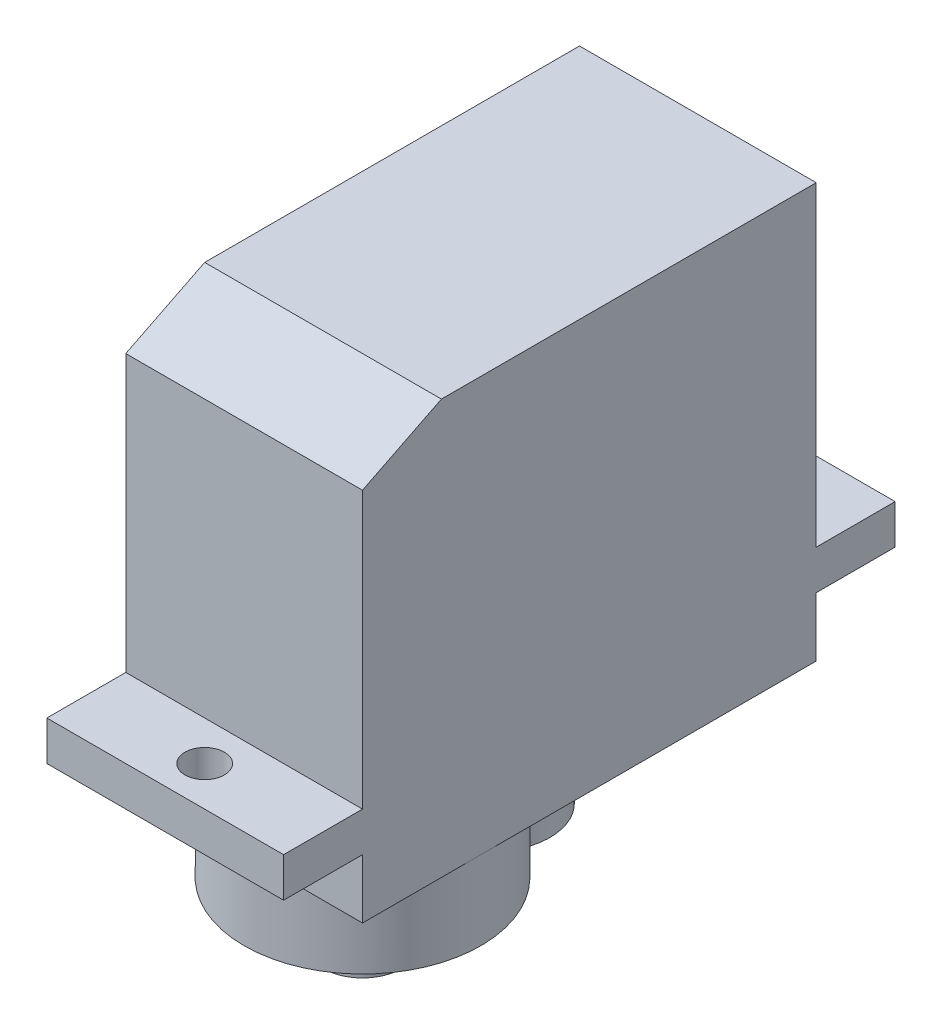
ISO-10303-21;
HEADER;
FILE_DESCRIPTION(('STEP AP214'),'2;1');
FILE_NAME('part.step','',(''),(''),'','','');
FILE_SCHEMA(('AUTOMOTIVE_DESIGN { 1 0 10303 214 1 1 1 1 }'));
ENDSEC;
DATA;
#1=APPLICATION_CONTEXT('core data for automotive mechanical design processes');
#2=APPLICATION_PROTOCOL_DEFINITION('international standard','automotive_design',2000,#1);
#3=PRODUCT_CONTEXT('',#1,'mechanical');
#4=PRODUCT('Part','Part','',(#3));
#5=PRODUCT_RELATED_PRODUCT_CATEGORY('part','',(#4));
#6=PRODUCT_DEFINITION_FORMATION('','',#4);
#7=PRODUCT_DEFINITION_CONTEXT('part definition',#1,'design');
#8=PRODUCT_DEFINITION('design','',#6,#7);
#9=PRODUCT_DEFINITION_SHAPE('','',#8);
#10=(LENGTH_UNIT() NAMED_UNIT(*) SI_UNIT(.MILLI.,.METRE.));
#11=(NAMED_UNIT(*) PLANE_ANGLE_UNIT() SI_UNIT($,.RADIAN.));
#12=(NAMED_UNIT(*) SI_UNIT($,.STERADIAN.) SOLID_ANGLE_UNIT());
#13=UNCERTAINTY_MEASURE_WITH_UNIT(LENGTH_MEASURE(1.E-05),#10,'distance_accuracy_value','');
#14=(GEOMETRIC_REPRESENTATION_CONTEXT(3) GLOBAL_UNCERTAINTY_ASSIGNED_CONTEXT((#13)) GLOBAL_UNIT_ASSIGNED_CONTEXT((#10,
#11,#12)) REPRESENTATION_CONTEXT('',''));
#15=CARTESIAN_POINT('',(0.,0.,0.));
#16=DIRECTION('',(0.,0.,1.));
#17=DIRECTION('',(1.,0.,0.));
#18=AXIS2_PLACEMENT_3D('',#15,#16,#17);
#19=CARTESIAN_POINT('',(0.,0.,0.));
#20=DIRECTION('',(0.,1.,0.));
#21=DIRECTION('',(0.,0.,1.));
#22=AXIS2_PLACEMENT_3D('',#19,#20,#21);
#23=PLANE('',#22);
#24=CARTESIAN_POINT('',(0.,0.,-1.));
#25=DIRECTION('',(0.,-1.,0.));
#26=DIRECTION('',(0.,0.,-1.));
#27=AXIS2_PLACEMENT_3D('',#24,#25,#26);
#28=CIRCLE('',#27,3.);
#29=CARTESIAN_POINT('',(-2.761139354061,0.,0.173076923076922));
#30=VERTEX_POINT('',#29);
#31=CARTESIAN_POINT('',(2.761139354061,0.,0.173076923076922));
#32=VERTEX_POINT('',#31);
#33=EDGE_CURVE('E239',#30,#32,#28,.T.);
#34=ORIENTED_EDGE('',*,*,#33,.F.);
#35=CARTESIAN_POINT('',(0.,0.,5.5));
#36=DIRECTION('',(0.,-1.,0.));
#37=DIRECTION('',(0.,0.,-1.));
#38=AXIS2_PLACEMENT_3D('',#35,#36,#37);
#39=CIRCLE('',#38,6.);
#40=CARTESIAN_POINT('',(-6.,0.,5.5));
#41=VERTEX_POINT('',#40);
#42=EDGE_CURVE('E220',#41,#30,#39,.T.);
#43=ORIENTED_EDGE('',*,*,#42,.F.);
#44=DIRECTION('',(0.,0.,1.));
#45=VECTOR('',#44,1.);
#46=CARTESIAN_POINT('',(-6.,0.,-11.5));
#47=LINE('',#46,#45);
#48=CARTESIAN_POINT('',(-6.,0.,-11.5));
#49=VERTEX_POINT('',#48);
#50=EDGE_CURVE('E266',#49,#41,#47,.T.);
#51=ORIENTED_EDGE('',*,*,#50,.F.);
#52=DIRECTION('',(-1.,0.,0.));
#53=VECTOR('',#52,1.);
#54=CARTESIAN_POINT('',(-6.,0.,-11.5));
#55=LINE('',#54,#53);
#56=CARTESIAN_POINT('',(6.,0.,-11.5));
#57=VERTEX_POINT('',#56);
#58=EDGE_CURVE('E252',#57,#49,#55,.T.);
#59=ORIENTED_EDGE('',*,*,#58,.F.);
#60=DIRECTION('',(0.,0.,-1.));
#61=VECTOR('',#60,1.);
#62=CARTESIAN_POINT('',(6.,0.,-11.5));
#63=LINE('',#62,#61);
#64=CARTESIAN_POINT('',(6.,0.,5.5));
#65=VERTEX_POINT('',#64);
#66=EDGE_CURVE('E250',#65,#57,#63,.T.);
#67=ORIENTED_EDGE('',*,*,#66,.F.);
#68=EDGE_CURVE('E89',#32,#65,#39,.T.);
#69=ORIENTED_EDGE('',*,*,#68,.F.);
#70=EDGE_LOOP('',(#34,#43,#51,#59,#67,#69));
#71=FACE_BOUND('',#70,.T.);
#72=ADVANCED_FACE('F64',(#71),#23,.F.);
#73=CARTESIAN_POINT('',(0.,0.,11.5));
#74=VERTEX_POINT('',#73);
#75=EDGE_CURVE('E73',#65,#74,#39,.T.);
#76=ORIENTED_EDGE('',*,*,#75,.F.);
#77=CARTESIAN_POINT('',(6.,0.,11.5));
#78=VERTEX_POINT('',#77);
#79=EDGE_CURVE('E247',#78,#65,#63,.T.);
#80=ORIENTED_EDGE('',*,*,#79,.F.);
#81=DIRECTION('',(1.,0.,0.));
#82=VECTOR('',#81,1.);
#83=CARTESIAN_POINT('',(-6.,0.,11.5));
#84=LINE('',#83,#82);
#85=EDGE_CURVE('E248',#74,#78,#84,.T.);
#86=ORIENTED_EDGE('',*,*,#85,.F.);
#87=EDGE_LOOP('',(#76,#80,#86));
#88=FACE_BOUND('',#87,.T.);
#89=ADVANCED_FACE('F245',(#88),#23,.F.);
#90=CARTESIAN_POINT('',(-6.,21.,-11.5));
#91=DIRECTION('',(0.,0.,1.));
#92=DIRECTION('',(1.,0.,0.));
#93=AXIS2_PLACEMENT_3D('',#90,#91,#92);
#94=PLANE('',#93);
#95=DIRECTION('',(-1.,0.,0.));
#96=VECTOR('',#95,1.);
#97=CARTESIAN_POINT('',(0.,3.,-11.5));
#98=LINE('',#97,#96);
#99=CARTESIAN_POINT('',(6.,3.00000000000001,-11.5));
#100=VERTEX_POINT('',#99);
#101=CARTESIAN_POINT('',(-5.99999999999987,3.,-11.5));
#102=VERTEX_POINT('',#101);
#103=EDGE_CURVE('E309',#100,#102,#98,.T.);
#104=ORIENTED_EDGE('',*,*,#103,.F.);
#105=DIRECTION('',(0.,-1.,0.));
#106=VECTOR('',#105,1.);
#107=CARTESIAN_POINT('',(6.,21.,-11.5));
#108=LINE('',#107,#106);
#109=EDGE_CURVE('E211',#100,#57,#108,.T.);
#110=ORIENTED_EDGE('',*,*,#109,.T.);
#111=ORIENTED_EDGE('',*,*,#58,.T.);
#112=DIRECTION('',(0.,-1.,0.));
#113=VECTOR('',#112,1.);
#114=CARTESIAN_POINT('',(-6.,21.,-11.5));
#115=LINE('',#114,#113);
#116=EDGE_CURVE('E203',#102,#49,#115,.T.);
#117=ORIENTED_EDGE('',*,*,#116,.F.);
#118=EDGE_LOOP('',(#104,#110,#111,#117));
#119=FACE_BOUND('',#118,.T.);
#120=ADVANCED_FACE('F351',(#119),#94,.F.);
#121=CARTESIAN_POINT('',(-6.,21.,11.5));
#122=DIRECTION('',(0.,0.,-1.));
#123=DIRECTION('',(-1.,0.,0.));
#124=AXIS2_PLACEMENT_3D('',#121,#122,#123);
#125=PLANE('',#124);
#126=DIRECTION('',(0.,-1.,0.));
#127=VECTOR('',#126,1.);
#128=CARTESIAN_POINT('',(6.,21.,11.5));
#129=LINE('',#128,#127);
#130=CARTESIAN_POINT('',(6.,19.,11.5));
#131=VERTEX_POINT('',#130);
#132=CARTESIAN_POINT('',(6.,5.,11.5));
#133=VERTEX_POINT('',#132);
#134=EDGE_CURVE('E197',#131,#133,#129,.T.);
#135=ORIENTED_EDGE('',*,*,#134,.F.);
#136=DIRECTION('',(1.,0.,0.));
#137=VECTOR('',#136,1.);
#138=CARTESIAN_POINT('',(-6.,19.,11.5));
#139=LINE('',#138,#137);
#140=CARTESIAN_POINT('',(-6.,19.,11.5));
#141=VERTEX_POINT('',#140);
#142=EDGE_CURVE('E184',#141,#131,#139,.T.);
#143=ORIENTED_EDGE('',*,*,#142,.F.);
#144=DIRECTION('',(0.,-1.,0.));
#145=VECTOR('',#144,1.);
#146=CARTESIAN_POINT('',(-6.,21.,11.5));
#147=LINE('',#146,#145);
#148=CARTESIAN_POINT('',(-6.,5.,11.5));
#149=VERTEX_POINT('',#148);
#150=EDGE_CURVE('E195',#141,#149,#147,.T.);
#151=ORIENTED_EDGE('',*,*,#150,.T.);
#152=DIRECTION('',(-1.,0.,0.));
#153=VECTOR('',#152,1.);
#154=CARTESIAN_POINT('',(0.,5.,11.5));
#155=LINE('',#154,#153);
#156=EDGE_CURVE('E292',#133,#149,#155,.T.);
#157=ORIENTED_EDGE('',*,*,#156,.F.);
#158=EDGE_LOOP('',(#135,#143,#151,#157));
#159=FACE_BOUND('',#158,.T.);
#160=ADVANCED_FACE('F193',(#159),#125,.F.);
#161=CARTESIAN_POINT('',(6.,21.,-11.5));
#162=DIRECTION('',(-1.,0.,0.));
#163=DIRECTION('',(0.,0.,1.));
#164=AXIS2_PLACEMENT_3D('',#161,#162,#163);
#165=PLANE('',#164);
#166=DIRECTION('',(0.,0.,-1.));
#167=VECTOR('',#166,1.);
#168=CARTESIAN_POINT('',(6.,21.,-11.5));
#169=LINE('',#168,#167);
#170=CARTESIAN_POINT('',(6.,21.,7.5));
#171=VERTEX_POINT('',#170);
#172=CARTESIAN_POINT('',(6.,21.,-11.5));
#173=VERTEX_POINT('',#172);
#174=EDGE_CURVE('E269',#171,#173,#169,.T.);
#175=ORIENTED_EDGE('',*,*,#174,.F.);
#176=DIRECTION('',(0.,0.447213595499957,-0.894427190999916));
#177=VECTOR('',#176,1.);
#178=CARTESIAN_POINT('',(6.,19.8,9.89999999999999));
#179=LINE('',#178,#177);
#180=EDGE_CURVE('E81',#131,#171,#179,.T.);
#181=ORIENTED_EDGE('',*,*,#180,.F.);
#182=ORIENTED_EDGE('',*,*,#134,.T.);
#183=DIRECTION('',(0.,0.,1.));
#184=VECTOR('',#183,1.);
#185=CARTESIAN_POINT('',(6.00000000000002,5.,0.));
#186=LINE('',#185,#184);
#187=CARTESIAN_POINT('',(6.,5.,15.5));
#188=VERTEX_POINT('',#187);
#189=EDGE_CURVE('E290',#133,#188,#186,.T.);
#190=ORIENTED_EDGE('',*,*,#189,.T.);
#191=DIRECTION('',(0.,1.,0.));
#192=VECTOR('',#191,1.);
#193=CARTESIAN_POINT('',(6.,3.,15.5));
#194=LINE('',#193,#192);
#195=CARTESIAN_POINT('',(6.,3.,15.5));
#196=VERTEX_POINT('',#195);
#197=EDGE_CURVE('E254',#196,#188,#194,.T.);
#198=ORIENTED_EDGE('',*,*,#197,.F.);
#199=DIRECTION('',(0.,0.,1.));
#200=VECTOR('',#199,1.);
#201=CARTESIAN_POINT('',(6.00000000000002,3.,0.));
#202=LINE('',#201,#200);
#203=CARTESIAN_POINT('',(6.,3.,11.5));
#204=VERTEX_POINT('',#203);
#205=EDGE_CURVE('E297',#204,#196,#202,.T.);
#206=ORIENTED_EDGE('',*,*,#205,.F.);
#207=EDGE_CURVE('E259',#204,#78,#129,.T.);
#208=ORIENTED_EDGE('',*,*,#207,.T.);
#209=ORIENTED_EDGE('',*,*,#79,.T.);
#210=ORIENTED_EDGE('',*,*,#66,.T.);
#211=ORIENTED_EDGE('',*,*,#109,.F.);
#212=DIRECTION('',(0.,0.,-1.));
#213=VECTOR('',#212,1.);
#214=CARTESIAN_POINT('',(6.00000000000013,3.,0.));
#215=LINE('',#214,#213);
#216=CARTESIAN_POINT('',(6.00000000000013,3.,-15.5));
#217=VERTEX_POINT('',#216);
#218=EDGE_CURVE('E305',#100,#217,#215,.T.);
#219=ORIENTED_EDGE('',*,*,#218,.T.);
#220=DIRECTION('',(0.,1.,0.));
#221=VECTOR('',#220,1.);
#222=CARTESIAN_POINT('',(6.00000000000013,3.,-15.5));
#223=LINE('',#222,#221);
#224=CARTESIAN_POINT('',(6.00000000000013,5.,-15.5));
#225=VERTEX_POINT('',#224);
#226=EDGE_CURVE('E303',#217,#225,#223,.T.);
#227=ORIENTED_EDGE('',*,*,#226,.T.);
#228=DIRECTION('',(0.,0.,-1.));
#229=VECTOR('',#228,1.);
#230=CARTESIAN_POINT('',(6.00000000000013,5.,0.));
#231=LINE('',#230,#229);
#232=CARTESIAN_POINT('',(6.,5.00000000000001,-11.5));
#233=VERTEX_POINT('',#232);
#234=EDGE_CURVE('E306',#233,#225,#231,.T.);
#235=ORIENTED_EDGE('',*,*,#234,.F.);
#236=EDGE_CURVE('E68',#173,#233,#108,.T.);
#237=ORIENTED_EDGE('',*,*,#236,.F.);
#238=EDGE_LOOP('',(#175,#181,#182,#190,#198,#206,#208,#209,#210,#211,#219,#227,#235,#237));
#239=FACE_BOUND('',#238,.T.);
#240=ADVANCED_FACE('F66',(#239),#165,.F.);
#241=ORIENTED_EDGE('',*,*,#236,.T.);
#242=DIRECTION('',(-1.,0.,0.));
#243=VECTOR('',#242,1.);
#244=CARTESIAN_POINT('',(0.,5.,-11.5));
#245=LINE('',#244,#243);
#246=CARTESIAN_POINT('',(-6.,5.00000000000001,-11.5));
#247=VERTEX_POINT('',#246);
#248=EDGE_CURVE('E315',#233,#247,#245,.T.);
#249=ORIENTED_EDGE('',*,*,#248,.T.);
#250=CARTESIAN_POINT('',(-6.,21.,-11.5));
#251=VERTEX_POINT('',#250);
#252=EDGE_CURVE('E206',#251,#247,#115,.T.);
#253=ORIENTED_EDGE('',*,*,#252,.F.);
#254=DIRECTION('',(-1.,0.,0.));
#255=VECTOR('',#254,1.);
#256=CARTESIAN_POINT('',(-6.,21.,-11.5));
#257=LINE('',#256,#255);
#258=EDGE_CURVE('E272',#173,#251,#257,.T.);
#259=ORIENTED_EDGE('',*,*,#258,.F.);
#260=EDGE_LOOP('',(#241,#249,#253,#259));
#261=FACE_BOUND('',#260,.T.);
#262=ADVANCED_FACE('F353',(#261),#94,.F.);
#263=CARTESIAN_POINT('',(-6.,21.,-11.5));
#264=DIRECTION('',(1.,0.,0.));
#265=DIRECTION('',(0.,0.,-1.));
#266=AXIS2_PLACEMENT_3D('',#263,#264,#265);
#267=PLANE('',#266);
#268=ORIENTED_EDGE('',*,*,#150,.F.);
#269=DIRECTION('',(0.,0.447213595499957,-0.894427190999916));
#270=VECTOR('',#269,1.);
#271=CARTESIAN_POINT('',(-6.,19.8,9.89999999999999));
#272=LINE('',#271,#270);
#273=CARTESIAN_POINT('',(-6.,21.,7.5));
#274=VERTEX_POINT('',#273);
#275=EDGE_CURVE('E181',#141,#274,#272,.T.);
#276=ORIENTED_EDGE('',*,*,#275,.T.);
#277=DIRECTION('',(0.,0.,1.));
#278=VECTOR('',#277,1.);
#279=CARTESIAN_POINT('',(-6.,21.,-11.5));
#280=LINE('',#279,#278);
#281=EDGE_CURVE('E263',#251,#274,#280,.T.);
#282=ORIENTED_EDGE('',*,*,#281,.F.);
#283=ORIENTED_EDGE('',*,*,#252,.T.);
#284=DIRECTION('',(0.,0.,-1.));
#285=VECTOR('',#284,1.);
#286=CARTESIAN_POINT('',(-5.99999999999987,5.,0.));
#287=LINE('',#286,#285);
#288=CARTESIAN_POINT('',(-5.99999999999987,5.,-15.5));
#289=VERTEX_POINT('',#288);
#290=EDGE_CURVE('E313',#247,#289,#287,.T.);
#291=ORIENTED_EDGE('',*,*,#290,.T.);
#292=DIRECTION('',(0.,1.,0.));
#293=VECTOR('',#292,1.);
#294=CARTESIAN_POINT('',(-5.99999999999987,3.,-15.5));
#295=LINE('',#294,#293);
#296=CARTESIAN_POINT('',(-5.99999999999987,3.,-15.5));
#297=VERTEX_POINT('',#296);
#298=EDGE_CURVE('E295',#297,#289,#295,.T.);
#299=ORIENTED_EDGE('',*,*,#298,.F.);
#300=DIRECTION('',(0.,0.,-1.));
#301=VECTOR('',#300,1.);
#302=CARTESIAN_POINT('',(-5.99999999999987,3.,0.));
#303=LINE('',#302,#301);
#304=EDGE_CURVE('E323',#102,#297,#303,.T.);
#305=ORIENTED_EDGE('',*,*,#304,.F.);
#306=ORIENTED_EDGE('',*,*,#116,.T.);
#307=ORIENTED_EDGE('',*,*,#50,.T.);
#308=CARTESIAN_POINT('',(-6.,0.,11.5));
#309=VERTEX_POINT('',#308);
#310=EDGE_CURVE('E260',#41,#309,#47,.T.);
#311=ORIENTED_EDGE('',*,*,#310,.T.);
#312=CARTESIAN_POINT('',(-6.,3.00000000000001,11.5));
#313=VERTEX_POINT('',#312);
#314=EDGE_CURVE('E204',#313,#309,#147,.T.);
#315=ORIENTED_EDGE('',*,*,#314,.F.);
#316=DIRECTION('',(0.,0.,1.));
#317=VECTOR('',#316,1.);
#318=CARTESIAN_POINT('',(-6.,3.,0.));
#319=LINE('',#318,#317);
#320=CARTESIAN_POINT('',(-6.,3.,15.5));
#321=VERTEX_POINT('',#320);
#322=EDGE_CURVE('E289',#313,#321,#319,.T.);
#323=ORIENTED_EDGE('',*,*,#322,.T.);
#324=DIRECTION('',(0.,1.,0.));
#325=VECTOR('',#324,1.);
#326=CARTESIAN_POINT('',(-6.,3.,15.5));
#327=LINE('',#326,#325);
#328=CARTESIAN_POINT('',(-6.,5.,15.5));
#329=VERTEX_POINT('',#328);
#330=EDGE_CURVE('E283',#321,#329,#327,.T.);
#331=ORIENTED_EDGE('',*,*,#330,.T.);
#332=DIRECTION('',(0.,0.,1.));
#333=VECTOR('',#332,1.);
#334=CARTESIAN_POINT('',(-6.,5.,0.));
#335=LINE('',#334,#333);
#336=EDGE_CURVE('E201',#149,#329,#335,.T.);
#337=ORIENTED_EDGE('',*,*,#336,.F.);
#338=EDGE_LOOP('',(#268,#276,#282,#283,#291,#299,#305,#306,#307,#311,#315,#323,#331,#337));
#339=FACE_BOUND('',#338,.T.);
#340=ADVANCED_FACE('F199',(#339),#267,.F.);
#341=ORIENTED_EDGE('',*,*,#207,.F.);
#342=DIRECTION('',(-1.,0.,0.));
#343=VECTOR('',#342,1.);
#344=CARTESIAN_POINT('',(0.,3.,11.5));
#345=LINE('',#344,#343);
#346=EDGE_CURVE('E277',#204,#313,#345,.T.);
#347=ORIENTED_EDGE('',*,*,#346,.T.);
#348=ORIENTED_EDGE('',*,*,#314,.T.);
#349=EDGE_CURVE('E268',#309,#74,#84,.T.);
#350=ORIENTED_EDGE('',*,*,#349,.T.);
#351=ORIENTED_EDGE('',*,*,#85,.T.);
#352=EDGE_LOOP('',(#341,#347,#348,#350,#351));
#353=FACE_BOUND('',#352,.T.);
#354=ADVANCED_FACE('F274',(#353),#125,.F.);
#355=CARTESIAN_POINT('',(0.,21.,0.));
#356=DIRECTION('',(0.,1.,0.));
#357=DIRECTION('',(0.,0.,1.));
#358=AXIS2_PLACEMENT_3D('',#355,#356,#357);
#359=PLANE('',#358);
#360=DIRECTION('',(1.,0.,0.));
#361=VECTOR('',#360,1.);
#362=CARTESIAN_POINT('',(-6.,21.,7.5));
#363=LINE('',#362,#361);
#364=EDGE_CURVE('E185',#274,#171,#363,.T.);
#365=ORIENTED_EDGE('',*,*,#364,.T.);
#366=ORIENTED_EDGE('',*,*,#174,.T.);
#367=ORIENTED_EDGE('',*,*,#258,.T.);
#368=ORIENTED_EDGE('',*,*,#281,.T.);
#369=EDGE_LOOP('',(#365,#366,#367,#368));
#370=FACE_BOUND('',#369,.T.);
#371=ADVANCED_FACE('F368',(#370),#359,.T.);
#372=EDGE_CURVE('E226',#74,#41,#39,.T.);
#373=ORIENTED_EDGE('',*,*,#372,.F.);
#374=ORIENTED_EDGE('',*,*,#349,.F.);
#375=ORIENTED_EDGE('',*,*,#310,.F.);
#376=EDGE_LOOP('',(#373,#374,#375));
#377=FACE_BOUND('',#376,.T.);
#378=ADVANCED_FACE('F348',(#377),#23,.F.);
#379=CARTESIAN_POINT('',(0.,3.,15.5));
#380=DIRECTION('',(0.,0.,-1.));
#381=DIRECTION('',(-1.,0.,0.));
#382=AXIS2_PLACEMENT_3D('',#379,#380,#381);
#383=PLANE('',#382);
#384=DIRECTION('',(-1.,0.,0.));
#385=VECTOR('',#384,1.);
#386=CARTESIAN_POINT('',(0.,5.,15.5));
#387=LINE('',#386,#385);
#388=EDGE_CURVE('E286',#188,#329,#387,.T.);
#389=ORIENTED_EDGE('',*,*,#388,.T.);
#390=ORIENTED_EDGE('',*,*,#330,.F.);
#391=DIRECTION('',(-1.,0.,0.));
#392=VECTOR('',#391,1.);
#393=CARTESIAN_POINT('',(0.,3.,15.5));
#394=LINE('',#393,#392);
#395=EDGE_CURVE('E285',#196,#321,#394,.T.);
#396=ORIENTED_EDGE('',*,*,#395,.F.);
#397=ORIENTED_EDGE('',*,*,#197,.T.);
#398=EDGE_LOOP('',(#389,#390,#396,#397));
#399=FACE_BOUND('',#398,.T.);
#400=ADVANCED_FACE('F367',(#399),#383,.F.);
#401=CARTESIAN_POINT('',(0.,3.,0.));
#402=DIRECTION('',(0.,-1.,0.));
#403=DIRECTION('',(0.,0.,-1.));
#404=AXIS2_PLACEMENT_3D('',#401,#402,#403);
#405=PLANE('',#404);
#406=CARTESIAN_POINT('',(0.,3.,13.5));
#407=DIRECTION('',(0.,1.,0.));
#408=DIRECTION('',(0.,0.,1.));
#409=AXIS2_PLACEMENT_3D('',#406,#407,#408);
#410=CIRCLE('',#409,1.);
#411=CARTESIAN_POINT('',(0.,3.,14.5));
#412=VERTEX_POINT('',#411);
#413=EDGE_CURVE('E317',#412,#412,#410,.T.);
#414=ORIENTED_EDGE('',*,*,#413,.T.);
#415=EDGE_LOOP('',(#414));
#416=FACE_BOUND('',#415,.T.);
#417=ORIENTED_EDGE('',*,*,#322,.F.);
#418=ORIENTED_EDGE('',*,*,#346,.F.);
#419=ORIENTED_EDGE('',*,*,#205,.T.);
#420=ORIENTED_EDGE('',*,*,#395,.T.);
#421=EDGE_LOOP('',(#417,#418,#419,#420));
#422=FACE_BOUND('',#421,.T.);
#423=ADVANCED_FACE('F373',(#416,#422),#405,.T.);
#424=CARTESIAN_POINT('',(0.,5.,0.));
#425=DIRECTION('',(0.,-1.,0.));
#426=DIRECTION('',(0.,0.,-1.));
#427=AXIS2_PLACEMENT_3D('',#424,#425,#426);
#428=PLANE('',#427);
#429=CARTESIAN_POINT('',(0.,5.,13.5));
#430=DIRECTION('',(0.,1.,0.));
#431=DIRECTION('',(0.,0.,1.));
#432=AXIS2_PLACEMENT_3D('',#429,#430,#431);
#433=CIRCLE('',#432,1.);
#434=CARTESIAN_POINT('',(0.,5.,14.5));
#435=VERTEX_POINT('',#434);
#436=EDGE_CURVE('E327',#435,#435,#433,.T.);
#437=ORIENTED_EDGE('',*,*,#436,.F.);
#438=EDGE_LOOP('',(#437));
#439=FACE_BOUND('',#438,.T.);
#440=ORIENTED_EDGE('',*,*,#336,.T.);
#441=ORIENTED_EDGE('',*,*,#388,.F.);
#442=ORIENTED_EDGE('',*,*,#189,.F.);
#443=ORIENTED_EDGE('',*,*,#156,.T.);
#444=EDGE_LOOP('',(#440,#441,#442,#443));
#445=FACE_BOUND('',#444,.T.);
#446=ADVANCED_FACE('F380',(#439,#445),#428,.F.);
#447=CARTESIAN_POINT('',(0.,3.,-15.5));
#448=DIRECTION('',(0.,0.,-1.));
#449=DIRECTION('',(-1.,0.,0.));
#450=AXIS2_PLACEMENT_3D('',#447,#448,#449);
#451=PLANE('',#450);
#452=DIRECTION('',(-1.,0.,0.));
#453=VECTOR('',#452,1.);
#454=CARTESIAN_POINT('',(0.,5.,-15.5));
#455=LINE('',#454,#453);
#456=EDGE_CURVE('E310',#225,#289,#455,.T.);
#457=ORIENTED_EDGE('',*,*,#456,.F.);
#458=ORIENTED_EDGE('',*,*,#226,.F.);
#459=DIRECTION('',(-1.,0.,0.));
#460=VECTOR('',#459,1.);
#461=CARTESIAN_POINT('',(0.,3.,-15.5));
#462=LINE('',#461,#460);
#463=EDGE_CURVE('E320',#217,#297,#462,.T.);
#464=ORIENTED_EDGE('',*,*,#463,.T.);
#465=ORIENTED_EDGE('',*,*,#298,.T.);
#466=EDGE_LOOP('',(#457,#458,#464,#465));
#467=FACE_BOUND('',#466,.T.);
#468=ADVANCED_FACE('F383',(#467),#451,.T.);
#469=CARTESIAN_POINT('',(0.,3.,0.));
#470=DIRECTION('',(0.,-1.,0.));
#471=DIRECTION('',(0.,0.,-1.));
#472=AXIS2_PLACEMENT_3D('',#469,#470,#471);
#473=PLANE('',#472);
#474=CARTESIAN_POINT('',(0.,3.,-13.5));
#475=DIRECTION('',(0.,1.,0.));
#476=DIRECTION('',(0.,0.,1.));
#477=AXIS2_PLACEMENT_3D('',#474,#475,#476);
#478=CIRCLE('',#477,1.);
#479=CARTESIAN_POINT('',(0.,3.,-12.5));
#480=VERTEX_POINT('',#479);
#481=EDGE_CURVE('E330',#480,#480,#478,.T.);
#482=ORIENTED_EDGE('',*,*,#481,.T.);
#483=EDGE_LOOP('',(#482));
#484=FACE_BOUND('',#483,.T.);
#485=ORIENTED_EDGE('',*,*,#103,.T.);
#486=ORIENTED_EDGE('',*,*,#304,.T.);
#487=ORIENTED_EDGE('',*,*,#463,.F.);
#488=ORIENTED_EDGE('',*,*,#218,.F.);
#489=EDGE_LOOP('',(#485,#486,#487,#488));
#490=FACE_BOUND('',#489,.T.);
#491=ADVANCED_FACE('F390',(#484,#490),#473,.T.);
#492=CARTESIAN_POINT('',(0.,5.,0.));
#493=DIRECTION('',(0.,-1.,0.));
#494=DIRECTION('',(0.,0.,-1.));
#495=AXIS2_PLACEMENT_3D('',#492,#493,#494);
#496=PLANE('',#495);
#497=CARTESIAN_POINT('',(0.,5.,-13.5));
#498=DIRECTION('',(0.,1.,0.));
#499=DIRECTION('',(0.,0.,1.));
#500=AXIS2_PLACEMENT_3D('',#497,#498,#499);
#501=CIRCLE('',#500,1.);
#502=CARTESIAN_POINT('',(0.,5.,-12.5));
#503=VERTEX_POINT('',#502);
#504=EDGE_CURVE('E333',#503,#503,#501,.T.);
#505=ORIENTED_EDGE('',*,*,#504,.F.);
#506=EDGE_LOOP('',(#505));
#507=FACE_BOUND('',#506,.T.);
#508=ORIENTED_EDGE('',*,*,#248,.F.);
#509=ORIENTED_EDGE('',*,*,#234,.T.);
#510=ORIENTED_EDGE('',*,*,#456,.T.);
#511=ORIENTED_EDGE('',*,*,#290,.F.);
#512=EDGE_LOOP('',(#508,#509,#510,#511));
#513=FACE_BOUND('',#512,.T.);
#514=ADVANCED_FACE('F392',(#507,#513),#496,.F.);
#515=CARTESIAN_POINT('',(0.,3.,13.5));
#516=DIRECTION('',(0.,1.,0.));
#517=DIRECTION('',(0.,0.,1.));
#518=AXIS2_PLACEMENT_3D('',#515,#516,#517);
#519=CYLINDRICAL_SURFACE('',#518,1.);
#520=ORIENTED_EDGE('',*,*,#413,.F.);
#521=EDGE_LOOP('',(#520));
#522=FACE_BOUND('',#521,.T.);
#523=ORIENTED_EDGE('',*,*,#436,.T.);
#524=EDGE_LOOP('',(#523));
#525=FACE_BOUND('',#524,.T.);
#526=ADVANCED_FACE('F395',(#522,#525),#519,.F.);
#527=CARTESIAN_POINT('',(0.,3.,-13.5));
#528=DIRECTION('',(0.,1.,0.));
#529=DIRECTION('',(0.,0.,1.));
#530=AXIS2_PLACEMENT_3D('',#527,#528,#529);
#531=CYLINDRICAL_SURFACE('',#530,1.);
#532=ORIENTED_EDGE('',*,*,#481,.F.);
#533=EDGE_LOOP('',(#532));
#534=FACE_BOUND('',#533,.T.);
#535=ORIENTED_EDGE('',*,*,#504,.T.);
#536=EDGE_LOOP('',(#535));
#537=FACE_BOUND('',#536,.T.);
#538=ADVANCED_FACE('F402',(#534,#537),#531,.F.);
#539=CARTESIAN_POINT('',(0.,-4.,0.));
#540=DIRECTION('',(0.,-1.,0.));
#541=DIRECTION('',(0.,0.,-1.));
#542=AXIS2_PLACEMENT_3D('',#539,#540,#541);
#543=PLANE('',#542);
#544=CARTESIAN_POINT('',(0.,-4.,5.5));
#545=DIRECTION('',(0.,-1.,0.));
#546=DIRECTION('',(0.,0.,-1.));
#547=AXIS2_PLACEMENT_3D('',#544,#545,#546);
#548=CIRCLE('',#547,2.);
#549=CARTESIAN_POINT('',(0.,-4.,3.5));
#550=VERTEX_POINT('',#549);
#551=EDGE_CURVE('E14',#550,#550,#548,.T.);
#552=ORIENTED_EDGE('',*,*,#551,.F.);
#553=EDGE_LOOP('',(#552));
#554=FACE_BOUND('',#553,.T.);
#555=CARTESIAN_POINT('',(0.,-4.,5.5));
#556=DIRECTION('',(0.,-1.,0.));
#557=DIRECTION('',(0.,0.,-1.));
#558=AXIS2_PLACEMENT_3D('',#555,#556,#557);
#559=CIRCLE('',#558,6.);
#560=CARTESIAN_POINT('',(2.761139354061,-4.,0.173076923076922));
#561=VERTEX_POINT('',#560);
#562=CARTESIAN_POINT('',(-2.761139354061,-4.,0.173076923076922));
#563=VERTEX_POINT('',#562);
#564=EDGE_CURVE('E233',#561,#563,#559,.T.);
#565=ORIENTED_EDGE('',*,*,#564,.T.);
#566=CARTESIAN_POINT('',(0.,-4.,-1.));
#567=DIRECTION('',(0.,-1.,0.));
#568=DIRECTION('',(0.,0.,-1.));
#569=AXIS2_PLACEMENT_3D('',#566,#567,#568);
#570=CIRCLE('',#569,3.);
#571=EDGE_CURVE('E234',#563,#561,#570,.T.);
#572=ORIENTED_EDGE('',*,*,#571,.T.);
#573=EDGE_LOOP('',(#565,#572));
#574=FACE_BOUND('',#573,.T.);
#575=ADVANCED_FACE('F406',(#554,#574),#543,.T.);
#576=CARTESIAN_POINT('',(0.,-4.,5.5));
#577=DIRECTION('',(0.,1.,0.));
#578=DIRECTION('',(0.,0.,1.));
#579=AXIS2_PLACEMENT_3D('',#576,#577,#578);
#580=CYLINDRICAL_SURFACE('',#579,6.);
#581=DIRECTION('',(0.,1.,0.));
#582=VECTOR('',#581,1.);
#583=CARTESIAN_POINT('',(-2.761139354061,-2.,0.173076923076922));
#584=LINE('',#583,#582);
#585=EDGE_CURVE('E336',#563,#30,#584,.T.);
#586=ORIENTED_EDGE('',*,*,#585,.F.);
#587=ORIENTED_EDGE('',*,*,#564,.F.);
#588=DIRECTION('',(0.,1.,0.));
#589=VECTOR('',#588,1.);
#590=CARTESIAN_POINT('',(2.761139354061,-4.,0.173076923076922));
#591=LINE('',#590,#589);
#592=EDGE_CURVE('E237',#561,#32,#591,.T.);
#593=ORIENTED_EDGE('',*,*,#592,.T.);
#594=ORIENTED_EDGE('',*,*,#68,.T.);
#595=ORIENTED_EDGE('',*,*,#75,.T.);
#596=ORIENTED_EDGE('',*,*,#372,.T.);
#597=ORIENTED_EDGE('',*,*,#42,.T.);
#598=EDGE_LOOP('',(#586,#587,#593,#594,#595,#596,#597));
#599=FACE_BOUND('',#598,.T.);
#600=ADVANCED_FACE('F241',(#599),#580,.T.);
#601=CARTESIAN_POINT('',(0.,-4.,-1.));
#602=DIRECTION('',(0.,1.,0.));
#603=DIRECTION('',(0.,0.,1.));
#604=AXIS2_PLACEMENT_3D('',#601,#602,#603);
#605=CYLINDRICAL_SURFACE('',#604,3.);
#606=ORIENTED_EDGE('',*,*,#571,.F.);
#607=ORIENTED_EDGE('',*,*,#585,.T.);
#608=ORIENTED_EDGE('',*,*,#33,.T.);
#609=ORIENTED_EDGE('',*,*,#592,.F.);
#610=EDGE_LOOP('',(#606,#607,#608,#609));
#611=FACE_BOUND('',#610,.T.);
#612=ADVANCED_FACE('F345',(#611),#605,.T.);
#613=CARTESIAN_POINT('',(0.,-7.,5.5));
#614=DIRECTION('',(0.,1.,0.));
#615=DIRECTION('',(0.,0.,1.));
#616=AXIS2_PLACEMENT_3D('',#613,#614,#615);
#617=CYLINDRICAL_SURFACE('',#616,2.);
#618=CARTESIAN_POINT('',(0.,-7.,5.5));
#619=DIRECTION('',(0.,-1.,0.));
#620=DIRECTION('',(0.,0.,-1.));
#621=AXIS2_PLACEMENT_3D('',#618,#619,#620);
#622=CIRCLE('',#621,2.);
#623=CARTESIAN_POINT('',(0.,-7.,3.5));
#624=VERTEX_POINT('',#623);
#625=EDGE_CURVE('E341',#624,#624,#622,.T.);
#626=ORIENTED_EDGE('',*,*,#625,.F.);
#627=EDGE_LOOP('',(#626));
#628=FACE_BOUND('',#627,.T.);
#629=ORIENTED_EDGE('',*,*,#551,.T.);
#630=EDGE_LOOP('',(#629));
#631=FACE_BOUND('',#630,.T.);
#632=ADVANCED_FACE('F410',(#628,#631),#617,.T.);
#633=CARTESIAN_POINT('',(0.,-7.,5.5));
#634=DIRECTION('',(0.,-1.,0.));
#635=DIRECTION('',(0.,0.,-1.));
#636=AXIS2_PLACEMENT_3D('',#633,#634,#635);
#637=PLANE('',#636);
#638=ORIENTED_EDGE('',*,*,#625,.T.);
#639=EDGE_LOOP('',(#638));
#640=FACE_BOUND('',#639,.T.);
#641=ADVANCED_FACE('F418',(#640),#637,.T.);
#642=CARTESIAN_POINT('',(-6.,19.8,9.89999999999999));
#643=DIRECTION('',(0.,-0.894427190999916,-0.447213595499957));
#644=DIRECTION('',(0.,0.447213595499957,-0.894427190999916));
#645=AXIS2_PLACEMENT_3D('',#642,#643,#644);
#646=PLANE('',#645);
#647=ORIENTED_EDGE('',*,*,#180,.T.);
#648=ORIENTED_EDGE('',*,*,#364,.F.);
#649=ORIENTED_EDGE('',*,*,#275,.F.);
#650=ORIENTED_EDGE('',*,*,#142,.T.);
#651=EDGE_LOOP('',(#647,#648,#649,#650));
#652=FACE_BOUND('',#651,.T.);
#653=ADVANCED_FACE('F183',(#652),#646,.F.);
#654=CLOSED_SHELL('',(#72,#89,#120,#160,#240,#262,#340,#354,#371,#378,#400,#423,#446,#468,#491,
#514,#526,#538,#575,#600,#612,#632,#641,#653));
#655=MANIFOLD_SOLID_BREP('B2',#654);
#656=ADVANCED_BREP_SHAPE_REPRESENTATION('',(#18,#655),#14);
#657=SHAPE_DEFINITION_REPRESENTATION(#9,#656);
ENDSEC;
END-ISO-10303-21;
